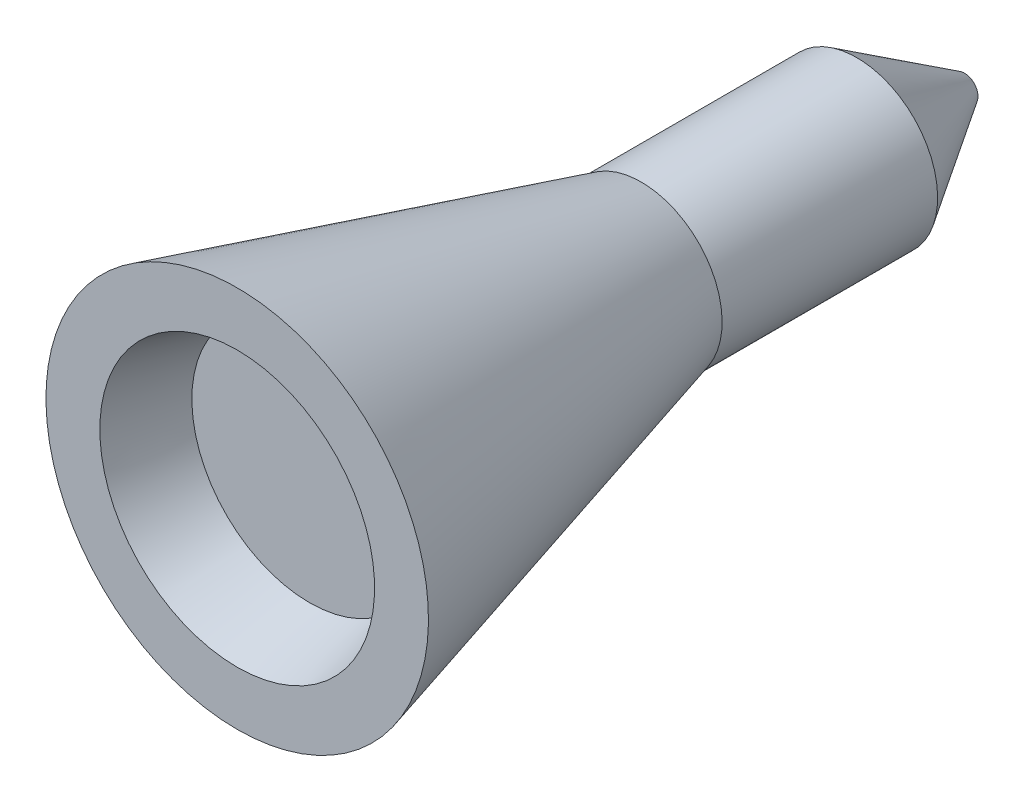
ISO-10303-21;
HEADER;
FILE_DESCRIPTION(('STEP AP214'),'2;1');
FILE_NAME('part.step','',(''),(''),'','','');
FILE_SCHEMA(('AUTOMOTIVE_DESIGN { 1 0 10303 214 1 1 1 1 }'));
ENDSEC;
DATA;
#1=APPLICATION_CONTEXT('core data for automotive mechanical design processes');
#2=APPLICATION_PROTOCOL_DEFINITION('international standard','automotive_design',2000,#1);
#3=PRODUCT_CONTEXT('',#1,'mechanical');
#4=PRODUCT('Part','Part','',(#3));
#5=PRODUCT_RELATED_PRODUCT_CATEGORY('part','',(#4));
#6=PRODUCT_DEFINITION_FORMATION('','',#4);
#7=PRODUCT_DEFINITION_CONTEXT('part definition',#1,'design');
#8=PRODUCT_DEFINITION('design','',#6,#7);
#9=PRODUCT_DEFINITION_SHAPE('','',#8);
#10=(LENGTH_UNIT() NAMED_UNIT(*) SI_UNIT(.MILLI.,.METRE.));
#11=(NAMED_UNIT(*) PLANE_ANGLE_UNIT() SI_UNIT($,.RADIAN.));
#12=(NAMED_UNIT(*) SI_UNIT($,.STERADIAN.) SOLID_ANGLE_UNIT());
#13=UNCERTAINTY_MEASURE_WITH_UNIT(LENGTH_MEASURE(1.E-05),#10,'distance_accuracy_value','');
#14=(GEOMETRIC_REPRESENTATION_CONTEXT(3) GLOBAL_UNCERTAINTY_ASSIGNED_CONTEXT((#13)) GLOBAL_UNIT_ASSIGNED_CONTEXT((#10,
#11,#12)) REPRESENTATION_CONTEXT('',''));
#15=CARTESIAN_POINT('',(0.,0.,0.));
#16=DIRECTION('',(0.,0.,1.));
#17=DIRECTION('',(1.,0.,0.));
#18=AXIS2_PLACEMENT_3D('',#15,#16,#17);
#19=CARTESIAN_POINT('',(0.,0.,-19.3170731707317));
#20=DIRECTION('',(0.,0.,-1.));
#21=DIRECTION('',(0.,1.,0.));
#22=AXIS2_PLACEMENT_3D('',#19,#20,#21);
#23=PLANE('',#22);
#24=CARTESIAN_POINT('',(0.,-3.,-19.3170731707317));
#25=DIRECTION('',(0.,0.,1.));
#26=DIRECTION('',(0.,-1.,0.));
#27=AXIS2_PLACEMENT_3D('',#24,#25,#26);
#28=CIRCLE('',#27,0.499999999999999);
#29=CARTESIAN_POINT('',(0.,-3.5,-19.3170731707317));
#30=VERTEX_POINT('',#29);
#31=EDGE_CURVE('E10',#30,#30,#28,.T.);
#32=ORIENTED_EDGE('',*,*,#31,.F.);
#33=EDGE_LOOP('',(#32));
#34=FACE_BOUND('',#33,.T.);
#35=ADVANCED_FACE('F39',(#34),#23,.T.);
#36=CARTESIAN_POINT('',(0.,-3.,-15.3170731707317));
#37=DIRECTION('',(0.,0.,1.));
#38=DIRECTION('',(0.,-1.,0.));
#39=AXIS2_PLACEMENT_3D('',#36,#37,#38);
#40=CONICAL_SURFACE('',#39,3.,0.558599315343563);
#41=CARTESIAN_POINT('',(0.,-3.,-15.3170731707317));
#42=DIRECTION('',(0.,0.,1.));
#43=DIRECTION('',(0.,-1.,0.));
#44=AXIS2_PLACEMENT_3D('',#41,#42,#43);
#45=CIRCLE('',#44,3.);
#46=CARTESIAN_POINT('',(0.,-6.00000000000001,-15.3170731707317));
#47=VERTEX_POINT('',#46);
#48=EDGE_CURVE('E46',#47,#47,#45,.T.);
#49=CARTESIAN_POINT('',(0.,-3.5,-19.3170731707317));
#50=CARTESIAN_POINT('',(0.,-3.52604166666667,-19.2754065040651));
#51=CARTESIAN_POINT('',(0.,-3.55208333333334,-19.2337398373984));
#52=CARTESIAN_POINT('',(0.,-3.60416666666667,-19.1504065040651));
#53=CARTESIAN_POINT('',(0.,-3.63020833333334,-19.1087398373984));
#54=CARTESIAN_POINT('',(0.,-3.68229166666667,-19.0254065040651));
#55=CARTESIAN_POINT('',(0.,-3.70833333333334,-18.9837398373984));
#56=CARTESIAN_POINT('',(0.,-3.76041666666667,-18.9004065040651));
#57=CARTESIAN_POINT('',(0.,-3.78645833333334,-18.8587398373984));
#58=CARTESIAN_POINT('',(0.,-3.83854166666667,-18.7754065040651));
#59=CARTESIAN_POINT('',(0.,-3.86458333333334,-18.7337398373984));
#60=CARTESIAN_POINT('',(0.,-3.91666666666667,-18.6504065040651));
#61=CARTESIAN_POINT('',(0.,-3.94270833333334,-18.6087398373984));
#62=CARTESIAN_POINT('',(0.,-3.99479166666667,-18.5254065040651));
#63=CARTESIAN_POINT('',(0.,-4.02083333333334,-18.4837398373984));
#64=CARTESIAN_POINT('',(0.,-4.07291666666667,-18.4004065040651));
#65=CARTESIAN_POINT('',(0.,-4.09895833333334,-18.3587398373984));
#66=CARTESIAN_POINT('',(0.,-4.15104166666667,-18.2754065040651));
#67=CARTESIAN_POINT('',(0.,-4.17708333333334,-18.2337398373984));
#68=CARTESIAN_POINT('',(0.,-4.22916666666667,-18.1504065040651));
#69=CARTESIAN_POINT('',(0.,-4.25520833333334,-18.1087398373984));
#70=CARTESIAN_POINT('',(0.,-4.30729166666667,-18.0254065040651));
#71=CARTESIAN_POINT('',(0.,-4.33333333333334,-17.9837398373984));
#72=CARTESIAN_POINT('',(0.,-4.38541666666667,-17.9004065040651));
#73=CARTESIAN_POINT('',(0.,-4.41145833333334,-17.8587398373984));
#74=CARTESIAN_POINT('',(0.,-4.46354166666667,-17.7754065040651));
#75=CARTESIAN_POINT('',(0.,-4.48958333333334,-17.7337398373984));
#76=CARTESIAN_POINT('',(0.,-4.54166666666667,-17.6504065040651));
#77=CARTESIAN_POINT('',(0.,-4.56770833333334,-17.6087398373984));
#78=CARTESIAN_POINT('',(0.,-4.61979166666667,-17.5254065040651));
#79=CARTESIAN_POINT('',(0.,-4.64583333333334,-17.4837398373984));
#80=CARTESIAN_POINT('',(0.,-4.69791666666667,-17.4004065040651));
#81=CARTESIAN_POINT('',(0.,-4.72395833333334,-17.3587398373984));
#82=CARTESIAN_POINT('',(0.,-4.77604166666667,-17.2754065040651));
#83=CARTESIAN_POINT('',(0.,-4.80208333333334,-17.2337398373984));
#84=CARTESIAN_POINT('',(0.,-4.85416666666667,-17.1504065040651));
#85=CARTESIAN_POINT('',(0.,-4.88020833333334,-17.1087398373984));
#86=CARTESIAN_POINT('',(0.,-4.93229166666667,-17.0254065040651));
#87=CARTESIAN_POINT('',(0.,-4.95833333333334,-16.9837398373984));
#88=CARTESIAN_POINT('',(0.,-5.01041666666667,-16.9004065040651));
#89=CARTESIAN_POINT('',(0.,-5.03645833333334,-16.8587398373984));
#90=CARTESIAN_POINT('',(0.,-5.08854166666667,-16.7754065040651));
#91=CARTESIAN_POINT('',(0.,-5.11458333333334,-16.7337398373984));
#92=CARTESIAN_POINT('',(0.,-5.16666666666667,-16.6504065040651));
#93=CARTESIAN_POINT('',(0.,-5.19270833333334,-16.6087398373984));
#94=CARTESIAN_POINT('',(0.,-5.24479166666667,-16.5254065040651));
#95=CARTESIAN_POINT('',(0.,-5.27083333333334,-16.4837398373984));
#96=CARTESIAN_POINT('',(0.,-5.32291666666667,-16.4004065040651));
#97=CARTESIAN_POINT('',(0.,-5.34895833333334,-16.3587398373984));
#98=CARTESIAN_POINT('',(0.,-5.40104166666667,-16.2754065040651));
#99=CARTESIAN_POINT('',(0.,-5.42708333333334,-16.2337398373984));
#100=CARTESIAN_POINT('',(0.,-5.47916666666667,-16.1504065040651));
#101=CARTESIAN_POINT('',(0.,-5.50520833333334,-16.1087398373984));
#102=CARTESIAN_POINT('',(0.,-5.55729166666667,-16.0254065040651));
#103=CARTESIAN_POINT('',(0.,-5.58333333333334,-15.9837398373984));
#104=CARTESIAN_POINT('',(0.,-5.63541666666667,-15.9004065040651));
#105=CARTESIAN_POINT('',(0.,-5.66145833333334,-15.8587398373984));
#106=CARTESIAN_POINT('',(0.,-5.71354166666667,-15.7754065040651));
#107=CARTESIAN_POINT('',(0.,-5.73958333333334,-15.7337398373984));
#108=CARTESIAN_POINT('',(0.,-5.79166666666667,-15.6504065040651));
#109=CARTESIAN_POINT('',(0.,-5.81770833333334,-15.6087398373984));
#110=CARTESIAN_POINT('',(0.,-5.86979166666667,-15.525406504065));
#111=CARTESIAN_POINT('',(0.,-5.89583333333334,-15.4837398373984));
#112=CARTESIAN_POINT('',(0.,-5.94791666666667,-15.400406504065));
#113=CARTESIAN_POINT('',(0.,-5.97395833333334,-15.3587398373984));
#114=CARTESIAN_POINT('',(0.,-6.00000000000001,-15.3170731707317));
#115=B_SPLINE_CURVE_WITH_KNOTS('',3,(#49,#50,#51,#52,#53,#54,#55,#56,#57,#58,#59,#60,#61,#62,
#63,#64,#65,#66,#67,#68,#69,#70,#71,#72,#73,#74,#75,#76,#77,#78,#79,#80,#81,#82,#83,#84,#85,#86,
#87,#88,#89,#90,#91,#92,#93,#94,#95,#96,#97,#98,#99,#100,#101,#102,#103,#104,#105,#106,#107,
#108,#109,#110,#111,#112,#113,#114),.UNSPECIFIED.,.F.,.F.,(4,2,2,2,2,2,2,2,2,2,2,2,2,2,2,2,2,2,
2,2,2,2,2,2,2,2,2,2,2,2,2,2,4),(0.,0.147405955188385,0.294811910376769,0.442217865565154,
0.589623820753538,0.737029775941923,0.884435731130308,1.03184168631869,1.17924764150708,
1.32665359669546,1.47405955188385,1.62146550707223,1.76887146226062,1.916277417449,
2.06368337263739,2.21108932782577,2.35849528301416,2.50590123820254,2.65330719339093,
2.80071314857931,2.9481191037677,3.09552505895608,3.24293101414447,3.39033696933285,
3.53774292452124,3.68514887970962,3.832554834898,3.97996079008639,4.12736674527477,
4.27477270046316,4.42217865565154,4.56958461083993,4.71699056602831),.UNSPECIFIED.);
#116=EDGE_CURVE('BSEAM93',#30,#47,#115,.T.);
#117=ORIENTED_EDGE('',*,*,#31,.T.);
#118=ORIENTED_EDGE('',*,*,#48,.F.);
#119=ORIENTED_EDGE('',*,*,#116,.T.);
#120=ORIENTED_EDGE('',*,*,#116,.F.);
#121=EDGE_LOOP('',(#117,#119,#118,#120));
#122=FACE_BOUND('',#121,.T.);
#123=ADVANCED_FACE('F93',(#122),#40,.T.);
#124=CARTESIAN_POINT('',(0.,-3.,5.));
#125=DIRECTION('',(0.,0.,1.));
#126=DIRECTION('',(0.,-1.,0.));
#127=AXIS2_PLACEMENT_3D('',#124,#125,#126);
#128=CYLINDRICAL_SURFACE('',#127,3.);
#129=CARTESIAN_POINT('',(0.,-3.,-7.31707317073171));
#130=DIRECTION('',(0.,0.,1.));
#131=DIRECTION('',(0.,-1.,0.));
#132=AXIS2_PLACEMENT_3D('',#129,#130,#131);
#133=CIRCLE('',#132,3.);
#134=CARTESIAN_POINT('',(0.,-6.00000000000001,-7.31707317073171));
#135=VERTEX_POINT('',#134);
#136=EDGE_CURVE('E51',#135,#135,#133,.T.);
#137=ORIENTED_EDGE('',*,*,#136,.F.);
#138=EDGE_LOOP('',(#137));
#139=FACE_BOUND('',#138,.T.);
#140=ORIENTED_EDGE('',*,*,#48,.T.);
#141=EDGE_LOOP('',(#140));
#142=FACE_BOUND('',#141,.T.);
#143=ADVANCED_FACE('F88',(#139,#142),#128,.T.);
#144=CARTESIAN_POINT('',(0.,-3.,-7.31707317073171));
#145=DIRECTION('',(0.,0.,1.));
#146=DIRECTION('',(0.,-1.,0.));
#147=AXIS2_PLACEMENT_3D('',#144,#145,#146);
#148=CONICAL_SURFACE('',#147,3.,0.26681606488356);
#149=CARTESIAN_POINT('',(0.,-3.,7.68292682926828));
#150=DIRECTION('',(0.,0.,1.));
#151=DIRECTION('',(0.,-1.,0.));
#152=AXIS2_PLACEMENT_3D('',#149,#150,#151);
#153=CIRCLE('',#152,7.1);
#154=CARTESIAN_POINT('',(0.,-10.1,7.68292682926828));
#155=VERTEX_POINT('',#154);
#156=EDGE_CURVE('E56',#155,#155,#153,.T.);
#157=ORIENTED_EDGE('',*,*,#156,.F.);
#158=EDGE_LOOP('',(#157));
#159=FACE_BOUND('',#158,.T.);
#160=ORIENTED_EDGE('',*,*,#136,.T.);
#161=EDGE_LOOP('',(#160));
#162=FACE_BOUND('',#161,.T.);
#163=ADVANCED_FACE('F82',(#159,#162),#148,.T.);
#164=CARTESIAN_POINT('',(0.,0.,7.68292682926828));
#165=DIRECTION('',(0.,0.,-1.));
#166=DIRECTION('',(0.,1.,0.));
#167=AXIS2_PLACEMENT_3D('',#164,#165,#166);
#168=PLANE('',#167);
#169=CARTESIAN_POINT('',(0.,-3.,7.68292682926828));
#170=DIRECTION('',(0.,0.,1.));
#171=DIRECTION('',(0.,-1.,0.));
#172=AXIS2_PLACEMENT_3D('',#169,#170,#171);
#173=CIRCLE('',#172,5.1);
#174=CARTESIAN_POINT('',(0.,-8.1,7.68292682926828));
#175=VERTEX_POINT('',#174);
#176=EDGE_CURVE('E62',#175,#175,#173,.T.);
#177=ORIENTED_EDGE('',*,*,#176,.F.);
#178=EDGE_LOOP('',(#177));
#179=FACE_BOUND('',#178,.T.);
#180=ORIENTED_EDGE('',*,*,#156,.T.);
#181=EDGE_LOOP('',(#180));
#182=FACE_BOUND('',#181,.T.);
#183=ADVANCED_FACE('F76',(#179,#182),#168,.F.);
#184=CARTESIAN_POINT('',(0.,-3.,7.68292682926828));
#185=DIRECTION('',(0.,0.,1.));
#186=DIRECTION('',(0.,-1.,0.));
#187=AXIS2_PLACEMENT_3D('',#184,#185,#186);
#188=CONICAL_SURFACE('',#187,5.1,0.26681606488356);
#189=CARTESIAN_POINT('',(0.,-3.,5.));
#190=DIRECTION('',(0.,0.,1.));
#191=DIRECTION('',(0.,-1.,0.));
#192=AXIS2_PLACEMENT_3D('',#189,#190,#191);
#193=CIRCLE('',#192,4.36666666666667);
#194=CARTESIAN_POINT('',(0.,-7.36666666666668,5.));
#195=VERTEX_POINT('',#194);
#196=EDGE_CURVE('E66',#195,#195,#193,.T.);
#197=ORIENTED_EDGE('',*,*,#196,.F.);
#198=EDGE_LOOP('',(#197));
#199=FACE_BOUND('',#198,.T.);
#200=ORIENTED_EDGE('',*,*,#176,.T.);
#201=EDGE_LOOP('',(#200));
#202=FACE_BOUND('',#201,.T.);
#203=ADVANCED_FACE('F73',(#199,#202),#188,.F.);
#204=CARTESIAN_POINT('',(0.,0.,5.));
#205=DIRECTION('',(0.,0.,-1.));
#206=DIRECTION('',(0.,1.,0.));
#207=AXIS2_PLACEMENT_3D('',#204,#205,#206);
#208=PLANE('',#207);
#209=ORIENTED_EDGE('',*,*,#196,.T.);
#210=EDGE_LOOP('',(#209));
#211=FACE_BOUND('',#210,.T.);
#212=ADVANCED_FACE('F71',(#211),#208,.F.);
#213=CLOSED_SHELL('',(#35,#123,#143,#163,#183,#203,#212));
#214=MANIFOLD_SOLID_BREP('B2',#213);
#215=ADVANCED_BREP_SHAPE_REPRESENTATION('',(#18,#214),#14);
#216=SHAPE_DEFINITION_REPRESENTATION(#9,#215);
ENDSEC;
END-ISO-10303-21;
